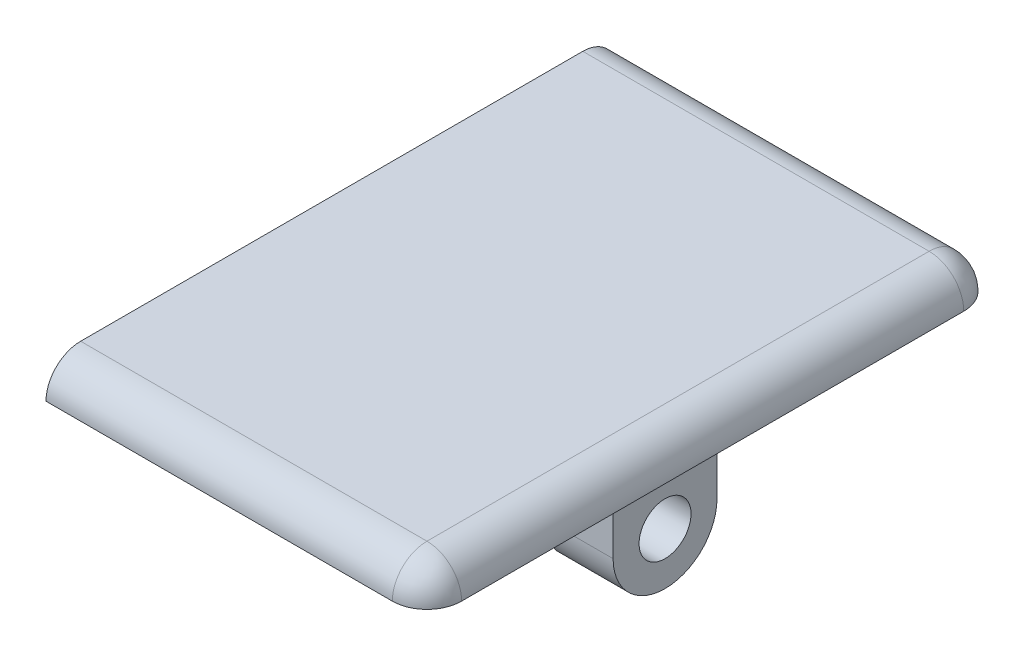
ISO-10303-21;
HEADER;
FILE_DESCRIPTION(('STEP AP214'),'2;1');
FILE_NAME('part.step','',(''),(''),'','','');
FILE_SCHEMA(('AUTOMOTIVE_DESIGN { 1 0 10303 214 1 1 1 1 }'));
ENDSEC;
DATA;
#1=APPLICATION_CONTEXT('core data for automotive mechanical design processes');
#2=APPLICATION_PROTOCOL_DEFINITION('international standard','automotive_design',2000,#1);
#3=PRODUCT_CONTEXT('',#1,'mechanical');
#4=PRODUCT('Part','Part','',(#3));
#5=PRODUCT_RELATED_PRODUCT_CATEGORY('part','',(#4));
#6=PRODUCT_DEFINITION_FORMATION('','',#4);
#7=PRODUCT_DEFINITION_CONTEXT('part definition',#1,'design');
#8=PRODUCT_DEFINITION('design','',#6,#7);
#9=PRODUCT_DEFINITION_SHAPE('','',#8);
#10=(LENGTH_UNIT() NAMED_UNIT(*) SI_UNIT(.MILLI.,.METRE.));
#11=(NAMED_UNIT(*) PLANE_ANGLE_UNIT() SI_UNIT($,.RADIAN.));
#12=(NAMED_UNIT(*) SI_UNIT($,.STERADIAN.) SOLID_ANGLE_UNIT());
#13=UNCERTAINTY_MEASURE_WITH_UNIT(LENGTH_MEASURE(1.E-05),#10,'distance_accuracy_value','');
#14=(GEOMETRIC_REPRESENTATION_CONTEXT(3) GLOBAL_UNCERTAINTY_ASSIGNED_CONTEXT((#13)) GLOBAL_UNIT_ASSIGNED_CONTEXT((#10,
#11,#12)) REPRESENTATION_CONTEXT('',''));
#15=CARTESIAN_POINT('',(0.,0.,0.));
#16=DIRECTION('',(0.,0.,1.));
#17=DIRECTION('',(1.,0.,0.));
#18=AXIS2_PLACEMENT_3D('',#15,#16,#17);
#19=CARTESIAN_POINT('',(0.,-2.,0.));
#20=DIRECTION('',(0.,1.,0.));
#21=DIRECTION('',(0.,0.,1.));
#22=AXIS2_PLACEMENT_3D('',#19,#20,#21);
#23=PLANE('',#22);
#24=DIRECTION('',(1.,0.,0.));
#25=VECTOR('',#24,1.);
#26=CARTESIAN_POINT('',(-4.75,-2.,-17.5));
#27=LINE('',#26,#25);
#28=CARTESIAN_POINT('',(-4.75,-2.,-17.5));
#29=VERTEX_POINT('',#28);
#30=CARTESIAN_POINT('',(-0.749999999999999,-2.,-17.5));
#31=VERTEX_POINT('',#30);
#32=EDGE_CURVE('E197',#29,#31,#27,.T.);
#33=ORIENTED_EDGE('',*,*,#32,.F.);
#34=DIRECTION('',(0.,0.,1.));
#35=VECTOR('',#34,1.);
#36=CARTESIAN_POINT('',(-4.75,-2.,-11.5));
#37=LINE('',#36,#35);
#38=CARTESIAN_POINT('',(-4.75,-2.,-11.5));
#39=VERTEX_POINT('',#38);
#40=EDGE_CURVE('E217',#29,#39,#37,.T.);
#41=ORIENTED_EDGE('',*,*,#40,.T.);
#42=DIRECTION('',(1.,0.,0.));
#43=VECTOR('',#42,1.);
#44=CARTESIAN_POINT('',(-4.75,-2.,-11.5));
#45=LINE('',#44,#43);
#46=CARTESIAN_POINT('',(-0.749999999999999,-2.,-11.5));
#47=VERTEX_POINT('',#46);
#48=EDGE_CURVE('E200',#39,#47,#45,.T.);
#49=ORIENTED_EDGE('',*,*,#48,.T.);
#50=DIRECTION('',(0.,0.,-1.));
#51=VECTOR('',#50,1.);
#52=CARTESIAN_POINT('',(-0.750000000000001,-2.,-28.25));
#53=LINE('',#52,#51);
#54=CARTESIAN_POINT('',(-0.749999999999997,-2.,-0.749999999999998));
#55=VERTEX_POINT('',#54);
#56=EDGE_CURVE('E186',#55,#47,#53,.T.);
#57=ORIENTED_EDGE('',*,*,#56,.F.);
#58=DIRECTION('',(1.,0.,0.));
#59=VECTOR('',#58,1.);
#60=CARTESIAN_POINT('',(-19.25,-2.,-0.749999999999998));
#61=LINE('',#60,#59);
#62=CARTESIAN_POINT('',(-19.25,-2.,-0.749999999999998));
#63=VERTEX_POINT('',#62);
#64=EDGE_CURVE('E190',#63,#55,#61,.T.);
#65=ORIENTED_EDGE('',*,*,#64,.F.);
#66=DIRECTION('',(0.,0.,1.));
#67=VECTOR('',#66,1.);
#68=CARTESIAN_POINT('',(-19.25,-2.,-28.25));
#69=LINE('',#68,#67);
#70=CARTESIAN_POINT('',(-19.25,-2.,-28.25));
#71=VERTEX_POINT('',#70);
#72=EDGE_CURVE('E173',#71,#63,#69,.T.);
#73=ORIENTED_EDGE('',*,*,#72,.F.);
#74=DIRECTION('',(-1.,0.,0.));
#75=VECTOR('',#74,1.);
#76=CARTESIAN_POINT('',(-19.25,-2.,-28.25));
#77=LINE('',#76,#75);
#78=CARTESIAN_POINT('',(-0.750000000000001,-2.,-28.25));
#79=VERTEX_POINT('',#78);
#80=EDGE_CURVE('E164',#79,#71,#77,.T.);
#81=ORIENTED_EDGE('',*,*,#80,.F.);
#82=EDGE_CURVE('E189',#31,#79,#53,.T.);
#83=ORIENTED_EDGE('',*,*,#82,.F.);
#84=EDGE_LOOP('',(#33,#41,#49,#57,#65,#73,#81,#83));
#85=FACE_BOUND('',#84,.T.);
#86=ADVANCED_FACE('F33',(#85),#23,.F.);
#87=CARTESIAN_POINT('',(-19.25,-2.,-28.25));
#88=DIRECTION('',(-1.,0.,0.));
#89=DIRECTION('',(0.,0.,1.));
#90=AXIS2_PLACEMENT_3D('',#87,#88,#89);
#91=PLANE('',#90);
#92=DIRECTION('',(0.,0.,1.));
#93=VECTOR('',#92,1.);
#94=CARTESIAN_POINT('',(-19.25,0.,-28.25));
#95=LINE('',#94,#93);
#96=CARTESIAN_POINT('',(-19.25,0.,-28.25));
#97=VERTEX_POINT('',#96);
#98=CARTESIAN_POINT('',(-19.25,0.,-0.749999999999998));
#99=VERTEX_POINT('',#98);
#100=EDGE_CURVE('E180',#97,#99,#95,.T.);
#101=ORIENTED_EDGE('',*,*,#100,.F.);
#102=DIRECTION('',(0.,1.,0.));
#103=VECTOR('',#102,1.);
#104=CARTESIAN_POINT('',(-19.25,-2.,-28.25));
#105=LINE('',#104,#103);
#106=EDGE_CURVE('E160',#71,#97,#105,.T.);
#107=ORIENTED_EDGE('',*,*,#106,.F.);
#108=ORIENTED_EDGE('',*,*,#72,.T.);
#109=DIRECTION('',(0.,1.,0.));
#110=VECTOR('',#109,1.);
#111=CARTESIAN_POINT('',(-19.25,-2.,-0.749999999999998));
#112=LINE('',#111,#110);
#113=EDGE_CURVE('E161',#63,#99,#112,.T.);
#114=ORIENTED_EDGE('',*,*,#113,.T.);
#115=EDGE_LOOP('',(#101,#107,#108,#114));
#116=FACE_BOUND('',#115,.T.);
#117=ADVANCED_FACE('F260',(#116),#91,.T.);
#118=CARTESIAN_POINT('',(-19.25,-2.,-28.25));
#119=DIRECTION('',(0.,0.,-1.));
#120=DIRECTION('',(-1.,0.,0.));
#121=AXIS2_PLACEMENT_3D('',#118,#119,#120);
#122=PLANE('',#121);
#123=DIRECTION('',(-1.,0.,0.));
#124=VECTOR('',#123,1.);
#125=CARTESIAN_POINT('',(-19.25,0.,-28.25));
#126=LINE('',#125,#124);
#127=CARTESIAN_POINT('',(-0.750000000000001,0.,-28.25));
#128=VERTEX_POINT('',#127);
#129=EDGE_CURVE('E170',#128,#97,#126,.T.);
#130=ORIENTED_EDGE('',*,*,#129,.F.);
#131=DIRECTION('',(0.,1.,0.));
#132=VECTOR('',#131,1.);
#133=CARTESIAN_POINT('',(-0.750000000000001,-2.,-28.25));
#134=LINE('',#133,#132);
#135=EDGE_CURVE('E166',#79,#128,#134,.T.);
#136=ORIENTED_EDGE('',*,*,#135,.F.);
#137=ORIENTED_EDGE('',*,*,#80,.T.);
#138=ORIENTED_EDGE('',*,*,#106,.T.);
#139=EDGE_LOOP('',(#130,#136,#137,#138));
#140=FACE_BOUND('',#139,.T.);
#141=ADVANCED_FACE('F267',(#140),#122,.T.);
#142=CARTESIAN_POINT('',(-0.750000000000001,-2.,-28.25));
#143=DIRECTION('',(1.,0.,0.));
#144=DIRECTION('',(0.,0.,-1.));
#145=AXIS2_PLACEMENT_3D('',#142,#143,#144);
#146=PLANE('',#145);
#147=DIRECTION('',(0.,0.,-1.));
#148=VECTOR('',#147,1.);
#149=CARTESIAN_POINT('',(-0.750000000000001,0.,-28.25));
#150=LINE('',#149,#148);
#151=CARTESIAN_POINT('',(-0.749999999999997,0.,-0.749999999999998));
#152=VERTEX_POINT('',#151);
#153=EDGE_CURVE('E174',#152,#128,#150,.T.);
#154=ORIENTED_EDGE('',*,*,#153,.F.);
#155=DIRECTION('',(0.,1.,0.));
#156=VECTOR('',#155,1.);
#157=CARTESIAN_POINT('',(-0.749999999999997,-2.,-0.749999999999998));
#158=LINE('',#157,#156);
#159=EDGE_CURVE('E163',#55,#152,#158,.T.);
#160=ORIENTED_EDGE('',*,*,#159,.F.);
#161=ORIENTED_EDGE('',*,*,#56,.T.);
#162=DIRECTION('',(0.,-1.,0.));
#163=VECTOR('',#162,1.);
#164=CARTESIAN_POINT('',(-0.749999999999998,-5.,-11.5));
#165=LINE('',#164,#163);
#166=CARTESIAN_POINT('',(-0.749999999999998,-5.,-11.5));
#167=VERTEX_POINT('',#166);
#168=EDGE_CURVE('E204',#47,#167,#165,.T.);
#169=ORIENTED_EDGE('',*,*,#168,.T.);
#170=CARTESIAN_POINT('',(-0.749999999999999,-4.99999999999999,-14.5));
#171=DIRECTION('',(1.,0.,0.));
#172=DIRECTION('',(0.,0.,-1.));
#173=AXIS2_PLACEMENT_3D('',#170,#171,#172);
#174=CIRCLE('',#173,3.);
#175=CARTESIAN_POINT('',(-0.749999999999999,-5.,-17.5));
#176=VERTEX_POINT('',#175);
#177=EDGE_CURVE('E211',#167,#176,#174,.T.);
#178=ORIENTED_EDGE('',*,*,#177,.T.);
#179=DIRECTION('',(0.,1.,0.));
#180=VECTOR('',#179,1.);
#181=CARTESIAN_POINT('',(-0.749999999999999,-2.,-17.5));
#182=LINE('',#181,#180);
#183=EDGE_CURVE('E208',#176,#31,#182,.T.);
#184=ORIENTED_EDGE('',*,*,#183,.T.);
#185=ORIENTED_EDGE('',*,*,#82,.T.);
#186=ORIENTED_EDGE('',*,*,#135,.T.);
#187=EDGE_LOOP('',(#154,#160,#161,#169,#178,#184,#185,#186));
#188=FACE_BOUND('',#187,.T.);
#189=CARTESIAN_POINT('',(-0.749999999999999,-4.99999999999999,-14.5));
#190=DIRECTION('',(1.,0.,0.));
#191=DIRECTION('',(0.,0.,-1.));
#192=AXIS2_PLACEMENT_3D('',#189,#190,#191);
#193=CIRCLE('',#192,1.5);
#194=CARTESIAN_POINT('',(-0.749999999999999,-4.99999999999999,-16.));
#195=VERTEX_POINT('',#194);
#196=EDGE_CURVE('E225',#195,#195,#193,.T.);
#197=ORIENTED_EDGE('',*,*,#196,.F.);
#198=EDGE_LOOP('',(#197));
#199=FACE_BOUND('',#198,.T.);
#200=ADVANCED_FACE('F277',(#188,#199),#146,.T.);
#201=CARTESIAN_POINT('',(-19.25,-2.,-0.749999999999998));
#202=DIRECTION('',(0.,0.,1.));
#203=DIRECTION('',(1.,0.,0.));
#204=AXIS2_PLACEMENT_3D('',#201,#202,#203);
#205=PLANE('',#204);
#206=DIRECTION('',(1.,0.,0.));
#207=VECTOR('',#206,1.);
#208=CARTESIAN_POINT('',(-19.25,0.,-0.749999999999998));
#209=LINE('',#208,#207);
#210=EDGE_CURVE('E177',#99,#152,#209,.T.);
#211=ORIENTED_EDGE('',*,*,#210,.F.);
#212=ORIENTED_EDGE('',*,*,#113,.F.);
#213=ORIENTED_EDGE('',*,*,#64,.T.);
#214=ORIENTED_EDGE('',*,*,#159,.T.);
#215=EDGE_LOOP('',(#211,#212,#213,#214));
#216=FACE_BOUND('',#215,.T.);
#217=ADVANCED_FACE('F281',(#216),#205,.T.);
#218=CARTESIAN_POINT('',(-4.75,-4.99999999999999,-14.5));
#219=DIRECTION('',(1.,0.,0.));
#220=DIRECTION('',(0.,0.,-1.));
#221=AXIS2_PLACEMENT_3D('',#218,#219,#220);
#222=CYLINDRICAL_SURFACE('',#221,3.);
#223=ORIENTED_EDGE('',*,*,#177,.F.);
#224=DIRECTION('',(1.,0.,0.));
#225=VECTOR('',#224,1.);
#226=CARTESIAN_POINT('',(-4.75,-5.,-11.5));
#227=LINE('',#226,#225);
#228=CARTESIAN_POINT('',(-4.75,-5.,-11.5));
#229=VERTEX_POINT('',#228);
#230=EDGE_CURVE('E183',#229,#167,#227,.T.);
#231=ORIENTED_EDGE('',*,*,#230,.F.);
#232=CARTESIAN_POINT('',(-4.75,-4.99999999999999,-14.5));
#233=DIRECTION('',(1.,0.,0.));
#234=DIRECTION('',(0.,0.,-1.));
#235=AXIS2_PLACEMENT_3D('',#232,#233,#234);
#236=CIRCLE('',#235,3.);
#237=CARTESIAN_POINT('',(-4.75,-5.,-17.5));
#238=VERTEX_POINT('',#237);
#239=EDGE_CURVE('E207',#229,#238,#236,.T.);
#240=ORIENTED_EDGE('',*,*,#239,.T.);
#241=DIRECTION('',(1.,0.,0.));
#242=VECTOR('',#241,1.);
#243=CARTESIAN_POINT('',(-4.75,-5.,-17.5));
#244=LINE('',#243,#242);
#245=EDGE_CURVE('E195',#238,#176,#244,.T.);
#246=ORIENTED_EDGE('',*,*,#245,.T.);
#247=EDGE_LOOP('',(#223,#231,#240,#246));
#248=FACE_BOUND('',#247,.T.);
#249=ADVANCED_FACE('F273',(#248),#222,.T.);
#250=CARTESIAN_POINT('',(-4.75,-5.,-11.5));
#251=DIRECTION('',(0.,0.,1.));
#252=DIRECTION('',(1.,0.,0.));
#253=AXIS2_PLACEMENT_3D('',#250,#251,#252);
#254=PLANE('',#253);
#255=ORIENTED_EDGE('',*,*,#168,.F.);
#256=ORIENTED_EDGE('',*,*,#48,.F.);
#257=DIRECTION('',(0.,-1.,0.));
#258=VECTOR('',#257,1.);
#259=CARTESIAN_POINT('',(-4.75,-5.,-11.5));
#260=LINE('',#259,#258);
#261=EDGE_CURVE('E198',#39,#229,#260,.T.);
#262=ORIENTED_EDGE('',*,*,#261,.T.);
#263=ORIENTED_EDGE('',*,*,#230,.T.);
#264=EDGE_LOOP('',(#255,#256,#262,#263));
#265=FACE_BOUND('',#264,.T.);
#266=ADVANCED_FACE('F289',(#265),#254,.T.);
#267=CARTESIAN_POINT('',(-4.75,-2.,-17.5));
#268=DIRECTION('',(0.,0.,-1.));
#269=DIRECTION('',(-1.,0.,0.));
#270=AXIS2_PLACEMENT_3D('',#267,#268,#269);
#271=PLANE('',#270);
#272=ORIENTED_EDGE('',*,*,#183,.F.);
#273=ORIENTED_EDGE('',*,*,#245,.F.);
#274=DIRECTION('',(0.,1.,0.));
#275=VECTOR('',#274,1.);
#276=CARTESIAN_POINT('',(-4.75,-2.,-17.5));
#277=LINE('',#276,#275);
#278=EDGE_CURVE('E220',#238,#29,#277,.T.);
#279=ORIENTED_EDGE('',*,*,#278,.T.);
#280=ORIENTED_EDGE('',*,*,#32,.T.);
#281=EDGE_LOOP('',(#272,#273,#279,#280));
#282=FACE_BOUND('',#281,.T.);
#283=ADVANCED_FACE('F304',(#282),#271,.T.);
#284=CARTESIAN_POINT('',(-4.75,-4.99999999999999,-14.5));
#285=DIRECTION('',(1.,0.,0.));
#286=DIRECTION('',(0.,0.,-1.));
#287=AXIS2_PLACEMENT_3D('',#284,#285,#286);
#288=PLANE('',#287);
#289=CARTESIAN_POINT('',(-4.75,-4.99999999999999,-14.5));
#290=DIRECTION('',(1.,0.,0.));
#291=DIRECTION('',(0.,0.,-1.));
#292=AXIS2_PLACEMENT_3D('',#289,#290,#291);
#293=CIRCLE('',#292,1.5);
#294=CARTESIAN_POINT('',(-4.75,-4.99999999999999,-16.));
#295=VERTEX_POINT('',#294);
#296=EDGE_CURVE('E214',#295,#295,#293,.T.);
#297=ORIENTED_EDGE('',*,*,#296,.T.);
#298=EDGE_LOOP('',(#297));
#299=FACE_BOUND('',#298,.T.);
#300=ORIENTED_EDGE('',*,*,#239,.F.);
#301=ORIENTED_EDGE('',*,*,#261,.F.);
#302=ORIENTED_EDGE('',*,*,#40,.F.);
#303=ORIENTED_EDGE('',*,*,#278,.F.);
#304=EDGE_LOOP('',(#300,#301,#302,#303));
#305=FACE_BOUND('',#304,.T.);
#306=ADVANCED_FACE('F309',(#299,#305),#288,.F.);
#307=CARTESIAN_POINT('',(-4.75,-4.99999999999999,-14.5));
#308=DIRECTION('',(1.,0.,0.));
#309=DIRECTION('',(0.,0.,-1.));
#310=AXIS2_PLACEMENT_3D('',#307,#308,#309);
#311=CYLINDRICAL_SURFACE('',#310,1.5);
#312=ORIENTED_EDGE('',*,*,#296,.F.);
#313=EDGE_LOOP('',(#312));
#314=FACE_BOUND('',#313,.T.);
#315=ORIENTED_EDGE('',*,*,#196,.T.);
#316=EDGE_LOOP('',(#315));
#317=FACE_BOUND('',#316,.T.);
#318=ADVANCED_FACE('F319',(#314,#317),#311,.F.);
#319=CARTESIAN_POINT('',(0.,0.,0.));
#320=DIRECTION('',(0.,1.,0.));
#321=DIRECTION('',(0.,0.,1.));
#322=AXIS2_PLACEMENT_3D('',#319,#320,#321);
#323=PLANE('',#322);
#324=CARTESIAN_POINT('',(0.,0.,0.));
#325=DIRECTION('',(0.,1.,0.));
#326=DIRECTION('',(0.,0.,1.));
#327=AXIS2_PLACEMENT_3D('',#324,#325,#326);
#328=CIRCLE('',#327,2.);
#329=CARTESIAN_POINT('',(0.,0.,2.));
#330=VERTEX_POINT('',#329);
#331=CARTESIAN_POINT('',(1.99999999999999,0.,0.));
#332=VERTEX_POINT('',#331);
#333=EDGE_CURVE('E134',#330,#332,#328,.T.);
#334=ORIENTED_EDGE('',*,*,#333,.F.);
#335=DIRECTION('',(1.,0.,0.));
#336=VECTOR('',#335,1.);
#337=CARTESIAN_POINT('',(0.,0.,2.));
#338=LINE('',#337,#336);
#339=CARTESIAN_POINT('',(-20.,0.,2.));
#340=VERTEX_POINT('',#339);
#341=EDGE_CURVE('E231',#340,#330,#338,.T.);
#342=ORIENTED_EDGE('',*,*,#341,.F.);
#343=DIRECTION('',(0.,0.,1.));
#344=VECTOR('',#343,1.);
#345=CARTESIAN_POINT('',(-20.,0.,2.));
#346=LINE('',#345,#344);
#347=CARTESIAN_POINT('',(-20.,0.,-31.));
#348=VERTEX_POINT('',#347);
#349=EDGE_CURVE('E233',#348,#340,#346,.T.);
#350=ORIENTED_EDGE('',*,*,#349,.F.);
#351=DIRECTION('',(-1.,0.,0.));
#352=VECTOR('',#351,1.);
#353=CARTESIAN_POINT('',(0.,0.,-31.));
#354=LINE('',#353,#352);
#355=CARTESIAN_POINT('',(0.,0.,-31.));
#356=VERTEX_POINT('',#355);
#357=EDGE_CURVE('E235',#356,#348,#354,.T.);
#358=ORIENTED_EDGE('',*,*,#357,.F.);
#359=CARTESIAN_POINT('',(0.,0.,-29.));
#360=DIRECTION('',(0.,1.,0.));
#361=DIRECTION('',(0.,0.,1.));
#362=AXIS2_PLACEMENT_3D('',#359,#360,#361);
#363=CIRCLE('',#362,2.);
#364=CARTESIAN_POINT('',(1.99999999999999,0.,-29.));
#365=VERTEX_POINT('',#364);
#366=EDGE_CURVE('E137',#365,#356,#363,.T.);
#367=ORIENTED_EDGE('',*,*,#366,.F.);
#368=DIRECTION('',(0.,0.,-1.));
#369=VECTOR('',#368,1.);
#370=CARTESIAN_POINT('',(1.99999999999999,0.,-29.));
#371=LINE('',#370,#369);
#372=EDGE_CURVE('E129',#332,#365,#371,.T.);
#373=ORIENTED_EDGE('',*,*,#372,.F.);
#374=EDGE_LOOP('',(#334,#342,#350,#358,#367,#373));
#375=FACE_BOUND('',#374,.T.);
#376=ORIENTED_EDGE('',*,*,#129,.T.);
#377=ORIENTED_EDGE('',*,*,#100,.T.);
#378=ORIENTED_EDGE('',*,*,#210,.T.);
#379=ORIENTED_EDGE('',*,*,#153,.T.);
#380=EDGE_LOOP('',(#376,#377,#378,#379));
#381=FACE_BOUND('',#380,.T.);
#382=ADVANCED_FACE('F131',(#375,#381),#323,.F.);
#383=CARTESIAN_POINT('',(-20.,2.,2.));
#384=DIRECTION('',(1.,0.,0.));
#385=DIRECTION('',(0.,0.,-1.));
#386=AXIS2_PLACEMENT_3D('',#383,#384,#385);
#387=PLANE('',#386);
#388=DIRECTION('',(0.,0.,1.));
#389=VECTOR('',#388,1.);
#390=CARTESIAN_POINT('',(-20.,2.,2.));
#391=LINE('',#390,#389);
#392=CARTESIAN_POINT('',(-20.,2.,-29.));
#393=VERTEX_POINT('',#392);
#394=CARTESIAN_POINT('',(-20.,2.,0.));
#395=VERTEX_POINT('',#394);
#396=EDGE_CURVE('E228',#393,#395,#391,.T.);
#397=ORIENTED_EDGE('',*,*,#396,.F.);
#398=CARTESIAN_POINT('',(-20.,0.,-29.));
#399=DIRECTION('',(1.,0.,0.));
#400=DIRECTION('',(0.,0.,-1.));
#401=AXIS2_PLACEMENT_3D('',#398,#399,#400);
#402=CIRCLE('',#401,2.);
#403=EDGE_CURVE('E11',#393,#348,#402,.F.);
#404=ORIENTED_EDGE('',*,*,#403,.T.);
#405=ORIENTED_EDGE('',*,*,#349,.T.);
#406=CARTESIAN_POINT('',(-20.,0.,0.));
#407=DIRECTION('',(1.,0.,0.));
#408=DIRECTION('',(0.,0.,-1.));
#409=AXIS2_PLACEMENT_3D('',#406,#407,#408);
#410=CIRCLE('',#409,2.);
#411=EDGE_CURVE('E42',#340,#395,#410,.F.);
#412=ORIENTED_EDGE('',*,*,#411,.T.);
#413=EDGE_LOOP('',(#397,#404,#405,#412));
#414=FACE_BOUND('',#413,.T.);
#415=ADVANCED_FACE('F324',(#414),#387,.F.);
#416=CARTESIAN_POINT('',(0.,2.,0.));
#417=DIRECTION('',(0.,1.,0.));
#418=DIRECTION('',(0.,0.,1.));
#419=AXIS2_PLACEMENT_3D('',#416,#417,#418);
#420=PLANE('',#419);
#421=DIRECTION('',(0.,0.,-1.));
#422=VECTOR('',#421,1.);
#423=CARTESIAN_POINT('',(0.,2.,-29.));
#424=LINE('',#423,#422);
#425=CARTESIAN_POINT('',(0.,2.,0.));
#426=VERTEX_POINT('',#425);
#427=CARTESIAN_POINT('',(0.,2.,-29.));
#428=VERTEX_POINT('',#427);
#429=EDGE_CURVE('E50',#426,#428,#424,.T.);
#430=ORIENTED_EDGE('',*,*,#429,.T.);
#431=DIRECTION('',(-1.,0.,0.));
#432=VECTOR('',#431,1.);
#433=CARTESIAN_POINT('',(-20.,2.,-29.));
#434=LINE('',#433,#432);
#435=EDGE_CURVE('E156',#428,#393,#434,.T.);
#436=ORIENTED_EDGE('',*,*,#435,.T.);
#437=ORIENTED_EDGE('',*,*,#396,.T.);
#438=DIRECTION('',(1.,0.,0.));
#439=VECTOR('',#438,1.);
#440=CARTESIAN_POINT('',(0.,2.,0.));
#441=LINE('',#440,#439);
#442=EDGE_CURVE('E55',#395,#426,#441,.T.);
#443=ORIENTED_EDGE('',*,*,#442,.T.);
#444=EDGE_LOOP('',(#430,#436,#437,#443));
#445=FACE_BOUND('',#444,.T.);
#446=ADVANCED_FACE('F240',(#445),#420,.T.);
#447=CARTESIAN_POINT('',(0.,0.,0.));
#448=DIRECTION('',(-1.,0.,0.));
#449=DIRECTION('',(0.,0.,1.));
#450=AXIS2_PLACEMENT_3D('',#447,#448,#449);
#451=CYLINDRICAL_SURFACE('',#450,2.);
#452=ORIENTED_EDGE('',*,*,#411,.F.);
#453=ORIENTED_EDGE('',*,*,#341,.T.);
#454=CARTESIAN_POINT('',(0.,0.,0.));
#455=DIRECTION('',(1.,0.,0.));
#456=DIRECTION('',(0.,0.,-1.));
#457=AXIS2_PLACEMENT_3D('',#454,#455,#456);
#458=CIRCLE('',#457,2.);
#459=EDGE_CURVE('E37',#426,#330,#458,.T.);
#460=ORIENTED_EDGE('',*,*,#459,.F.);
#461=ORIENTED_EDGE('',*,*,#442,.F.);
#462=EDGE_LOOP('',(#452,#453,#460,#461));
#463=FACE_BOUND('',#462,.T.);
#464=ADVANCED_FACE('F35',(#463),#451,.T.);
#465=CARTESIAN_POINT('',(0.,0.,0.));
#466=DIRECTION('',(0.,1.,0.));
#467=DIRECTION('',(0.,0.,1.));
#468=AXIS2_PLACEMENT_3D('',#465,#466,#467);
#469=SPHERICAL_SURFACE('',#468,2.);
#470=ORIENTED_EDGE('',*,*,#459,.T.);
#471=ORIENTED_EDGE('',*,*,#333,.T.);
#472=CARTESIAN_POINT('',(0.,0.,0.));
#473=DIRECTION('',(0.,0.,-1.));
#474=DIRECTION('',(-1.,0.,0.));
#475=AXIS2_PLACEMENT_3D('',#472,#473,#474);
#476=CIRCLE('',#475,2.);
#477=EDGE_CURVE('E146',#426,#332,#476,.T.);
#478=ORIENTED_EDGE('',*,*,#477,.F.);
#479=EDGE_LOOP('',(#470,#471,#478));
#480=FACE_BOUND('',#479,.T.);
#481=ADVANCED_FACE('F145',(#480),#469,.T.);
#482=CARTESIAN_POINT('',(0.,0.,0.));
#483=DIRECTION('',(0.,0.,1.));
#484=DIRECTION('',(1.,0.,0.));
#485=AXIS2_PLACEMENT_3D('',#482,#483,#484);
#486=CYLINDRICAL_SURFACE('',#485,2.);
#487=ORIENTED_EDGE('',*,*,#477,.T.);
#488=ORIENTED_EDGE('',*,*,#372,.T.);
#489=CARTESIAN_POINT('',(0.,0.,-29.));
#490=DIRECTION('',(0.,0.,-1.));
#491=DIRECTION('',(-1.,0.,0.));
#492=AXIS2_PLACEMENT_3D('',#489,#490,#491);
#493=CIRCLE('',#492,2.);
#494=EDGE_CURVE('E149',#428,#365,#493,.T.);
#495=ORIENTED_EDGE('',*,*,#494,.F.);
#496=ORIENTED_EDGE('',*,*,#429,.F.);
#497=EDGE_LOOP('',(#487,#488,#495,#496));
#498=FACE_BOUND('',#497,.T.);
#499=ADVANCED_FACE('F148',(#498),#486,.T.);
#500=CARTESIAN_POINT('',(0.,0.,-29.));
#501=DIRECTION('',(0.,1.,0.));
#502=DIRECTION('',(0.,0.,1.));
#503=AXIS2_PLACEMENT_3D('',#500,#501,#502);
#504=SPHERICAL_SURFACE('',#503,2.);
#505=ORIENTED_EDGE('',*,*,#494,.T.);
#506=ORIENTED_EDGE('',*,*,#366,.T.);
#507=CARTESIAN_POINT('',(0.,0.,-29.));
#508=DIRECTION('',(-1.,0.,0.));
#509=DIRECTION('',(0.,0.,1.));
#510=AXIS2_PLACEMENT_3D('',#507,#508,#509);
#511=CIRCLE('',#510,2.);
#512=EDGE_CURVE('E150',#428,#356,#511,.T.);
#513=ORIENTED_EDGE('',*,*,#512,.F.);
#514=EDGE_LOOP('',(#505,#506,#513));
#515=FACE_BOUND('',#514,.T.);
#516=ADVANCED_FACE('F250',(#515),#504,.T.);
#517=CARTESIAN_POINT('',(0.,0.,-29.));
#518=DIRECTION('',(1.,0.,0.));
#519=DIRECTION('',(0.,0.,-1.));
#520=AXIS2_PLACEMENT_3D('',#517,#518,#519);
#521=CYLINDRICAL_SURFACE('',#520,2.);
#522=ORIENTED_EDGE('',*,*,#512,.T.);
#523=ORIENTED_EDGE('',*,*,#357,.T.);
#524=ORIENTED_EDGE('',*,*,#403,.F.);
#525=ORIENTED_EDGE('',*,*,#435,.F.);
#526=EDGE_LOOP('',(#522,#523,#524,#525));
#527=FACE_BOUND('',#526,.T.);
#528=ADVANCED_FACE('F247',(#527),#521,.T.);
#529=CLOSED_SHELL('',(#86,#117,#141,#200,#217,#249,#266,#283,#306,#318,#382,#415,#446,#464,#481,
#499,#516,#528));
#530=MANIFOLD_SOLID_BREP('B2',#529);
#531=ADVANCED_BREP_SHAPE_REPRESENTATION('',(#18,#530),#14);
#532=SHAPE_DEFINITION_REPRESENTATION(#9,#531);
ENDSEC;
END-ISO-10303-21;
